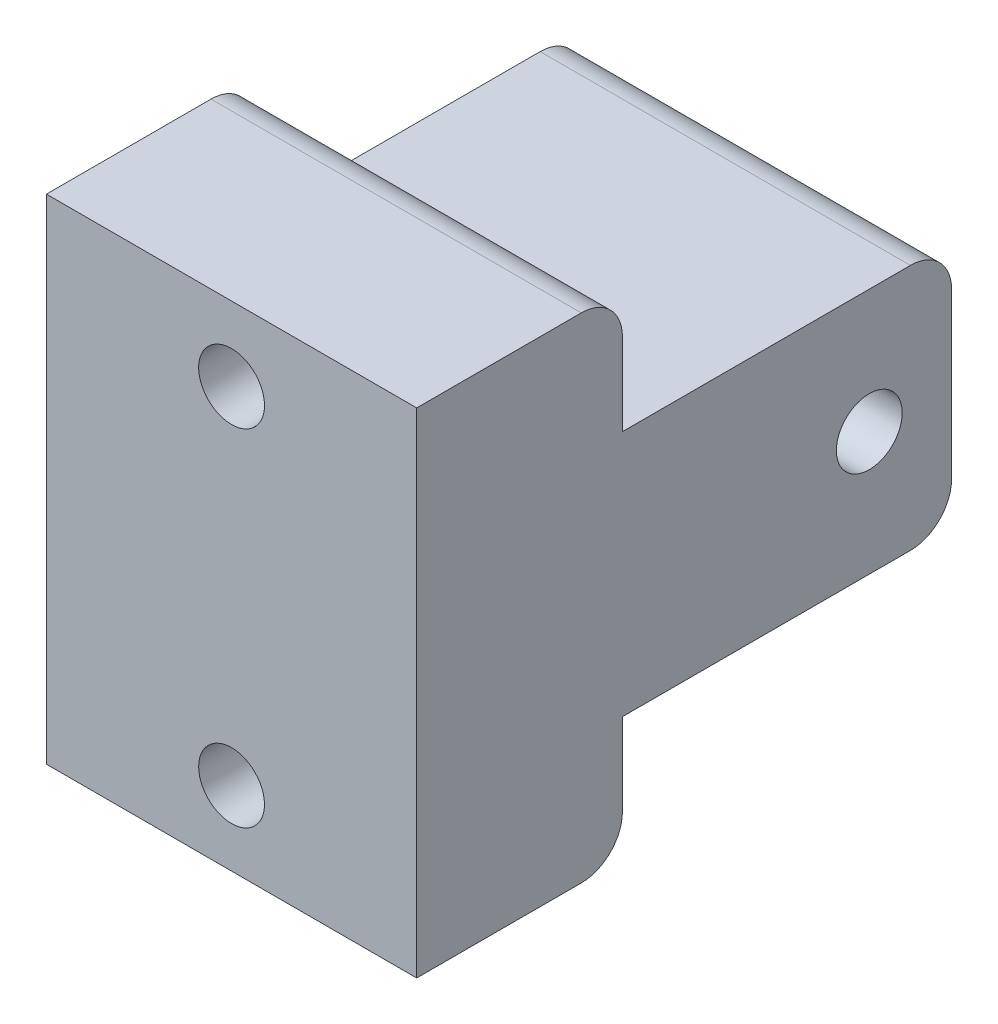
ISO-10303-21;
HEADER;
FILE_DESCRIPTION(('STEP AP214'),'2;1');
FILE_NAME('part.step','',(''),(''),'','','');
FILE_SCHEMA(('AUTOMOTIVE_DESIGN { 1 0 10303 214 1 1 1 1 }'));
ENDSEC;
DATA;
#1=APPLICATION_CONTEXT('core data for automotive mechanical design processes');
#2=APPLICATION_PROTOCOL_DEFINITION('international standard','automotive_design',2000,#1);
#3=PRODUCT_CONTEXT('',#1,'mechanical');
#4=PRODUCT('Part','Part','',(#3));
#5=PRODUCT_RELATED_PRODUCT_CATEGORY('part','',(#4));
#6=PRODUCT_DEFINITION_FORMATION('','',#4);
#7=PRODUCT_DEFINITION_CONTEXT('part definition',#1,'design');
#8=PRODUCT_DEFINITION('design','',#6,#7);
#9=PRODUCT_DEFINITION_SHAPE('','',#8);
#10=(LENGTH_UNIT() NAMED_UNIT(*) SI_UNIT(.MILLI.,.METRE.));
#11=(NAMED_UNIT(*) PLANE_ANGLE_UNIT() SI_UNIT($,.RADIAN.));
#12=(NAMED_UNIT(*) SI_UNIT($,.STERADIAN.) SOLID_ANGLE_UNIT());
#13=UNCERTAINTY_MEASURE_WITH_UNIT(LENGTH_MEASURE(1.E-05),#10,'distance_accuracy_value','');
#14=(GEOMETRIC_REPRESENTATION_CONTEXT(3) GLOBAL_UNCERTAINTY_ASSIGNED_CONTEXT((#13)) GLOBAL_UNIT_ASSIGNED_CONTEXT((#10,
#11,#12)) REPRESENTATION_CONTEXT('',''));
#15=CARTESIAN_POINT('',(0.,0.,0.));
#16=DIRECTION('',(0.,0.,1.));
#17=DIRECTION('',(1.,0.,0.));
#18=AXIS2_PLACEMENT_3D('',#15,#16,#17);
#19=CARTESIAN_POINT('',(45.,25.,25.));
#20=DIRECTION('',(1.,0.,0.));
#21=DIRECTION('',(0.,0.,-1.));
#22=AXIS2_PLACEMENT_3D('',#19,#20,#21);
#23=PLANE('',#22);
#24=DIRECTION('',(0.,1.,0.));
#25=VECTOR('',#24,1.);
#26=CARTESIAN_POINT('',(45.,15.,20.));
#27=LINE('',#26,#25);
#28=CARTESIAN_POINT('',(45.,15.,20.));
#29=VERTEX_POINT('',#28);
#30=CARTESIAN_POINT('',(45.,25.,20.));
#31=VERTEX_POINT('',#30);
#32=EDGE_CURVE('E140',#29,#31,#27,.T.);
#33=ORIENTED_EDGE('',*,*,#32,.T.);
#34=CARTESIAN_POINT('',(45.,25.,25.));
#35=DIRECTION('',(1.,0.,0.));
#36=DIRECTION('',(0.,0.,-1.));
#37=AXIS2_PLACEMENT_3D('',#34,#35,#36);
#38=CIRCLE('',#37,5.);
#39=CARTESIAN_POINT('',(45.,30.,25.));
#40=VERTEX_POINT('',#39);
#41=EDGE_CURVE('E131',#31,#40,#38,.T.);
#42=ORIENTED_EDGE('',*,*,#41,.T.);
#43=DIRECTION('',(0.,0.,1.));
#44=VECTOR('',#43,1.);
#45=CARTESIAN_POINT('',(45.,30.,25.));
#46=LINE('',#45,#44);
#47=CARTESIAN_POINT('',(45.,30.,45.));
#48=VERTEX_POINT('',#47);
#49=EDGE_CURVE('E139',#40,#48,#46,.T.);
#50=ORIENTED_EDGE('',*,*,#49,.T.);
#51=DIRECTION('',(0.,-1.,0.));
#52=VECTOR('',#51,1.);
#53=CARTESIAN_POINT('',(45.,-30.,45.));
#54=LINE('',#53,#52);
#55=CARTESIAN_POINT('',(45.,-30.,45.));
#56=VERTEX_POINT('',#55);
#57=EDGE_CURVE('E167',#48,#56,#54,.T.);
#58=ORIENTED_EDGE('',*,*,#57,.T.);
#59=DIRECTION('',(0.,0.,-1.));
#60=VECTOR('',#59,1.);
#61=CARTESIAN_POINT('',(45.,-30.,25.));
#62=LINE('',#61,#60);
#63=CARTESIAN_POINT('',(45.,-30.,25.));
#64=VERTEX_POINT('',#63);
#65=EDGE_CURVE('E169',#56,#64,#62,.T.);
#66=ORIENTED_EDGE('',*,*,#65,.T.);
#67=CARTESIAN_POINT('',(45.,-25.,25.));
#68=DIRECTION('',(1.,0.,0.));
#69=DIRECTION('',(0.,0.,-1.));
#70=AXIS2_PLACEMENT_3D('',#67,#68,#69);
#71=CIRCLE('',#70,5.);
#72=CARTESIAN_POINT('',(45.,-25.,20.));
#73=VERTEX_POINT('',#72);
#74=EDGE_CURVE('E171',#64,#73,#71,.T.);
#75=ORIENTED_EDGE('',*,*,#74,.T.);
#76=DIRECTION('',(0.,1.,0.));
#77=VECTOR('',#76,1.);
#78=CARTESIAN_POINT('',(45.,-25.,20.));
#79=LINE('',#78,#77);
#80=CARTESIAN_POINT('',(45.,-15.,20.));
#81=VERTEX_POINT('',#80);
#82=EDGE_CURVE('E173',#73,#81,#79,.T.);
#83=ORIENTED_EDGE('',*,*,#82,.T.);
#84=DIRECTION('',(0.,0.,-1.));
#85=VECTOR('',#84,1.);
#86=CARTESIAN_POINT('',(45.,-15.,20.));
#87=LINE('',#86,#85);
#88=CARTESIAN_POINT('',(45.,-15.,-15.));
#89=VERTEX_POINT('',#88);
#90=EDGE_CURVE('E175',#81,#89,#87,.T.);
#91=ORIENTED_EDGE('',*,*,#90,.T.);
#92=CARTESIAN_POINT('',(45.,-10.,-15.));
#93=DIRECTION('',(1.,0.,0.));
#94=DIRECTION('',(0.,0.,-1.));
#95=AXIS2_PLACEMENT_3D('',#92,#93,#94);
#96=CIRCLE('',#95,5.);
#97=CARTESIAN_POINT('',(45.,-9.99999999999996,-20.));
#98=VERTEX_POINT('',#97);
#99=EDGE_CURVE('E177',#89,#98,#96,.T.);
#100=ORIENTED_EDGE('',*,*,#99,.T.);
#101=DIRECTION('',(0.,1.,0.));
#102=VECTOR('',#101,1.);
#103=CARTESIAN_POINT('',(45.,9.99999999999997,-20.));
#104=LINE('',#103,#102);
#105=CARTESIAN_POINT('',(45.,9.99999999999997,-20.));
#106=VERTEX_POINT('',#105);
#107=EDGE_CURVE('E179',#98,#106,#104,.T.);
#108=ORIENTED_EDGE('',*,*,#107,.T.);
#109=CARTESIAN_POINT('',(45.,10.,-15.));
#110=DIRECTION('',(1.,0.,0.));
#111=DIRECTION('',(0.,0.,1.));
#112=AXIS2_PLACEMENT_3D('',#109,#110,#111);
#113=CIRCLE('',#112,5.);
#114=CARTESIAN_POINT('',(45.,15.,-15.));
#115=VERTEX_POINT('',#114);
#116=EDGE_CURVE('E181',#106,#115,#113,.T.);
#117=ORIENTED_EDGE('',*,*,#116,.T.);
#118=DIRECTION('',(0.,0.,1.));
#119=VECTOR('',#118,1.);
#120=CARTESIAN_POINT('',(45.,15.,20.));
#121=LINE('',#120,#119);
#122=EDGE_CURVE('E145',#115,#29,#121,.T.);
#123=ORIENTED_EDGE('',*,*,#122,.T.);
#124=EDGE_LOOP('',(#33,#42,#50,#58,#66,#75,#83,#91,#100,#108,#117,#123));
#125=FACE_BOUND('',#124,.T.);
#126=CARTESIAN_POINT('',(45.,0.,-9.99999999999999));
#127=DIRECTION('',(1.,0.,0.));
#128=DIRECTION('',(0.,0.,-1.));
#129=AXIS2_PLACEMENT_3D('',#126,#127,#128);
#130=CIRCLE('',#129,4.);
#131=CARTESIAN_POINT('',(45.,0.,-5.99999999999999));
#132=VERTEX_POINT('',#131);
#133=EDGE_CURVE('E156',#132,#132,#130,.T.);
#134=ORIENTED_EDGE('',*,*,#133,.F.);
#135=EDGE_LOOP('',(#134));
#136=FACE_BOUND('',#135,.T.);
#137=ADVANCED_FACE('F39',(#125,#136),#23,.T.);
#138=CARTESIAN_POINT('',(0.,25.,25.));
#139=DIRECTION('',(1.,0.,0.));
#140=DIRECTION('',(0.,0.,-1.));
#141=AXIS2_PLACEMENT_3D('',#138,#139,#140);
#142=PLANE('',#141);
#143=DIRECTION('',(0.,1.,0.));
#144=VECTOR('',#143,1.);
#145=CARTESIAN_POINT('',(0.,15.,20.));
#146=LINE('',#145,#144);
#147=CARTESIAN_POINT('',(0.,15.,20.));
#148=VERTEX_POINT('',#147);
#149=CARTESIAN_POINT('',(0.,25.,20.));
#150=VERTEX_POINT('',#149);
#151=EDGE_CURVE('E164',#148,#150,#146,.T.);
#152=ORIENTED_EDGE('',*,*,#151,.F.);
#153=DIRECTION('',(0.,0.,1.));
#154=VECTOR('',#153,1.);
#155=CARTESIAN_POINT('',(0.,15.,20.));
#156=LINE('',#155,#154);
#157=CARTESIAN_POINT('',(0.,15.,-15.));
#158=VERTEX_POINT('',#157);
#159=EDGE_CURVE('E149',#158,#148,#156,.T.);
#160=ORIENTED_EDGE('',*,*,#159,.F.);
#161=CARTESIAN_POINT('',(0.,10.,-15.));
#162=DIRECTION('',(1.,0.,0.));
#163=DIRECTION('',(0.,0.,1.));
#164=AXIS2_PLACEMENT_3D('',#161,#162,#163);
#165=CIRCLE('',#164,5.);
#166=CARTESIAN_POINT('',(0.,9.99999999999997,-20.));
#167=VERTEX_POINT('',#166);
#168=EDGE_CURVE('E205',#167,#158,#165,.T.);
#169=ORIENTED_EDGE('',*,*,#168,.F.);
#170=DIRECTION('',(0.,1.,0.));
#171=VECTOR('',#170,1.);
#172=CARTESIAN_POINT('',(0.,9.99999999999997,-20.));
#173=LINE('',#172,#171);
#174=CARTESIAN_POINT('',(0.,-9.99999999999996,-20.));
#175=VERTEX_POINT('',#174);
#176=EDGE_CURVE('E203',#175,#167,#173,.T.);
#177=ORIENTED_EDGE('',*,*,#176,.F.);
#178=CARTESIAN_POINT('',(0.,-10.,-15.));
#179=DIRECTION('',(1.,0.,0.));
#180=DIRECTION('',(0.,0.,-1.));
#181=AXIS2_PLACEMENT_3D('',#178,#179,#180);
#182=CIRCLE('',#181,5.);
#183=CARTESIAN_POINT('',(0.,-15.,-15.));
#184=VERTEX_POINT('',#183);
#185=EDGE_CURVE('E201',#184,#175,#182,.T.);
#186=ORIENTED_EDGE('',*,*,#185,.F.);
#187=DIRECTION('',(0.,0.,-1.));
#188=VECTOR('',#187,1.);
#189=CARTESIAN_POINT('',(0.,-15.,20.));
#190=LINE('',#189,#188);
#191=CARTESIAN_POINT('',(0.,-15.,20.));
#192=VERTEX_POINT('',#191);
#193=EDGE_CURVE('E199',#192,#184,#190,.T.);
#194=ORIENTED_EDGE('',*,*,#193,.F.);
#195=DIRECTION('',(0.,1.,0.));
#196=VECTOR('',#195,1.);
#197=CARTESIAN_POINT('',(0.,-25.,20.));
#198=LINE('',#197,#196);
#199=CARTESIAN_POINT('',(0.,-25.,20.));
#200=VERTEX_POINT('',#199);
#201=EDGE_CURVE('E197',#200,#192,#198,.T.);
#202=ORIENTED_EDGE('',*,*,#201,.F.);
#203=CARTESIAN_POINT('',(0.,-25.,25.));
#204=DIRECTION('',(1.,0.,0.));
#205=DIRECTION('',(0.,0.,-1.));
#206=AXIS2_PLACEMENT_3D('',#203,#204,#205);
#207=CIRCLE('',#206,5.);
#208=CARTESIAN_POINT('',(0.,-30.,25.));
#209=VERTEX_POINT('',#208);
#210=EDGE_CURVE('E194',#209,#200,#207,.T.);
#211=ORIENTED_EDGE('',*,*,#210,.F.);
#212=DIRECTION('',(0.,0.,-1.));
#213=VECTOR('',#212,1.);
#214=CARTESIAN_POINT('',(0.,-30.,25.));
#215=LINE('',#214,#213);
#216=CARTESIAN_POINT('',(0.,-30.,45.));
#217=VERTEX_POINT('',#216);
#218=EDGE_CURVE('E192',#217,#209,#215,.T.);
#219=ORIENTED_EDGE('',*,*,#218,.F.);
#220=DIRECTION('',(0.,-1.,0.));
#221=VECTOR('',#220,1.);
#222=CARTESIAN_POINT('',(0.,-30.,45.));
#223=LINE('',#222,#221);
#224=CARTESIAN_POINT('',(0.,30.,45.));
#225=VERTEX_POINT('',#224);
#226=EDGE_CURVE('E190',#225,#217,#223,.T.);
#227=ORIENTED_EDGE('',*,*,#226,.F.);
#228=DIRECTION('',(0.,0.,1.));
#229=VECTOR('',#228,1.);
#230=CARTESIAN_POINT('',(0.,30.,25.));
#231=LINE('',#230,#229);
#232=CARTESIAN_POINT('',(0.,30.,25.));
#233=VERTEX_POINT('',#232);
#234=EDGE_CURVE('E188',#233,#225,#231,.T.);
#235=ORIENTED_EDGE('',*,*,#234,.F.);
#236=CARTESIAN_POINT('',(0.,25.,25.));
#237=DIRECTION('',(1.,0.,0.));
#238=DIRECTION('',(0.,0.,-1.));
#239=AXIS2_PLACEMENT_3D('',#236,#237,#238);
#240=CIRCLE('',#239,5.);
#241=EDGE_CURVE('E186',#150,#233,#240,.T.);
#242=ORIENTED_EDGE('',*,*,#241,.F.);
#243=EDGE_LOOP('',(#152,#160,#169,#177,#186,#194,#202,#211,#219,#227,#235,#242));
#244=FACE_BOUND('',#243,.T.);
#245=CARTESIAN_POINT('',(0.,0.,-9.99999999999999));
#246=DIRECTION('',(1.,0.,0.));
#247=DIRECTION('',(0.,0.,-1.));
#248=AXIS2_PLACEMENT_3D('',#245,#246,#247);
#249=CIRCLE('',#248,4.);
#250=CARTESIAN_POINT('',(0.,0.,-5.99999999999999));
#251=VERTEX_POINT('',#250);
#252=EDGE_CURVE('E153',#251,#251,#249,.T.);
#253=ORIENTED_EDGE('',*,*,#252,.T.);
#254=EDGE_LOOP('',(#253));
#255=FACE_BOUND('',#254,.T.);
#256=ADVANCED_FACE('F242',(#244,#255),#142,.F.);
#257=CARTESIAN_POINT('',(45.,15.,20.));
#258=DIRECTION('',(0.,0.,1.));
#259=DIRECTION('',(1.,0.,0.));
#260=AXIS2_PLACEMENT_3D('',#257,#258,#259);
#261=PLANE('',#260);
#262=DIRECTION('',(-1.,0.,0.));
#263=VECTOR('',#262,1.);
#264=CARTESIAN_POINT('',(45.,25.,20.));
#265=LINE('',#264,#263);
#266=CARTESIAN_POINT('',(22.5,25.,20.));
#267=VERTEX_POINT('',#266);
#268=EDGE_CURVE('E48',#267,#150,#265,.T.);
#269=ORIENTED_EDGE('',*,*,#268,.F.);
#270=CARTESIAN_POINT('',(22.5,21.,20.));
#271=DIRECTION('',(0.,0.,1.));
#272=DIRECTION('',(1.,0.,0.));
#273=AXIS2_PLACEMENT_3D('',#270,#271,#272);
#274=CIRCLE('',#273,4.);
#275=EDGE_CURVE('E53',#267,#267,#274,.T.);
#276=ORIENTED_EDGE('',*,*,#275,.T.);
#277=EDGE_CURVE('E11',#31,#267,#265,.T.);
#278=ORIENTED_EDGE('',*,*,#277,.F.);
#279=ORIENTED_EDGE('',*,*,#32,.F.);
#280=DIRECTION('',(-1.,0.,0.));
#281=VECTOR('',#280,1.);
#282=CARTESIAN_POINT('',(45.,15.,20.));
#283=LINE('',#282,#281);
#284=EDGE_CURVE('E184',#29,#148,#283,.T.);
#285=ORIENTED_EDGE('',*,*,#284,.T.);
#286=ORIENTED_EDGE('',*,*,#151,.T.);
#287=EDGE_LOOP('',(#269,#276,#278,#279,#285,#286));
#288=FACE_BOUND('',#287,.T.);
#289=ADVANCED_FACE('F41',(#288),#261,.F.);
#290=CARTESIAN_POINT('',(45.,25.,25.));
#291=DIRECTION('',(-1.,0.,0.));
#292=DIRECTION('',(0.,0.,1.));
#293=AXIS2_PLACEMENT_3D('',#290,#291,#292);
#294=CYLINDRICAL_SURFACE('',#293,5.);
#295=ORIENTED_EDGE('',*,*,#241,.T.);
#296=DIRECTION('',(-1.,0.,0.));
#297=VECTOR('',#296,1.);
#298=CARTESIAN_POINT('',(45.,30.,25.));
#299=LINE('',#298,#297);
#300=EDGE_CURVE('E136',#40,#233,#299,.T.);
#301=ORIENTED_EDGE('',*,*,#300,.F.);
#302=ORIENTED_EDGE('',*,*,#41,.F.);
#303=ORIENTED_EDGE('',*,*,#277,.T.);
#304=ORIENTED_EDGE('',*,*,#268,.T.);
#305=EDGE_LOOP('',(#295,#301,#302,#303,#304));
#306=FACE_BOUND('',#305,.T.);
#307=ADVANCED_FACE('F133',(#306),#294,.T.);
#308=CARTESIAN_POINT('',(45.,30.,25.));
#309=DIRECTION('',(0.,-1.,0.));
#310=DIRECTION('',(0.,0.,-1.));
#311=AXIS2_PLACEMENT_3D('',#308,#309,#310);
#312=PLANE('',#311);
#313=ORIENTED_EDGE('',*,*,#234,.T.);
#314=DIRECTION('',(-1.,0.,0.));
#315=VECTOR('',#314,1.);
#316=CARTESIAN_POINT('',(45.,30.,45.));
#317=LINE('',#316,#315);
#318=EDGE_CURVE('E234',#48,#225,#317,.T.);
#319=ORIENTED_EDGE('',*,*,#318,.F.);
#320=ORIENTED_EDGE('',*,*,#49,.F.);
#321=ORIENTED_EDGE('',*,*,#300,.T.);
#322=EDGE_LOOP('',(#313,#319,#320,#321));
#323=FACE_BOUND('',#322,.T.);
#324=ADVANCED_FACE('F289',(#323),#312,.F.);
#325=CARTESIAN_POINT('',(45.,-30.,45.));
#326=DIRECTION('',(0.,0.,-1.));
#327=DIRECTION('',(-1.,0.,0.));
#328=AXIS2_PLACEMENT_3D('',#325,#326,#327);
#329=PLANE('',#328);
#330=CARTESIAN_POINT('',(22.5,21.,45.));
#331=DIRECTION('',(0.,0.,1.));
#332=DIRECTION('',(1.,0.,0.));
#333=AXIS2_PLACEMENT_3D('',#330,#331,#332);
#334=CIRCLE('',#333,4.);
#335=CARTESIAN_POINT('',(26.5,21.,45.));
#336=VERTEX_POINT('',#335);
#337=EDGE_CURVE('E158',#336,#336,#334,.T.);
#338=ORIENTED_EDGE('',*,*,#337,.F.);
#339=EDGE_LOOP('',(#338));
#340=FACE_BOUND('',#339,.T.);
#341=CARTESIAN_POINT('',(22.5,-21.,45.));
#342=DIRECTION('',(0.,0.,1.));
#343=DIRECTION('',(-1.,0.,0.));
#344=AXIS2_PLACEMENT_3D('',#341,#342,#343);
#345=CIRCLE('',#344,4.);
#346=CARTESIAN_POINT('',(18.5,-21.,45.));
#347=VERTEX_POINT('',#346);
#348=EDGE_CURVE('E161',#347,#347,#345,.T.);
#349=ORIENTED_EDGE('',*,*,#348,.F.);
#350=EDGE_LOOP('',(#349));
#351=FACE_BOUND('',#350,.T.);
#352=ORIENTED_EDGE('',*,*,#226,.T.);
#353=DIRECTION('',(-1.,0.,0.));
#354=VECTOR('',#353,1.);
#355=CARTESIAN_POINT('',(45.,-30.,45.));
#356=LINE('',#355,#354);
#357=EDGE_CURVE('E231',#56,#217,#356,.T.);
#358=ORIENTED_EDGE('',*,*,#357,.F.);
#359=ORIENTED_EDGE('',*,*,#57,.F.);
#360=ORIENTED_EDGE('',*,*,#318,.T.);
#361=EDGE_LOOP('',(#352,#358,#359,#360));
#362=FACE_BOUND('',#361,.T.);
#363=ADVANCED_FACE('F287',(#340,#351,#362),#329,.F.);
#364=CARTESIAN_POINT('',(45.,-30.,25.));
#365=DIRECTION('',(0.,1.,0.));
#366=DIRECTION('',(0.,0.,1.));
#367=AXIS2_PLACEMENT_3D('',#364,#365,#366);
#368=PLANE('',#367);
#369=ORIENTED_EDGE('',*,*,#218,.T.);
#370=DIRECTION('',(-1.,0.,0.));
#371=VECTOR('',#370,1.);
#372=CARTESIAN_POINT('',(45.,-30.,25.));
#373=LINE('',#372,#371);
#374=EDGE_CURVE('E228',#64,#209,#373,.T.);
#375=ORIENTED_EDGE('',*,*,#374,.F.);
#376=ORIENTED_EDGE('',*,*,#65,.F.);
#377=ORIENTED_EDGE('',*,*,#357,.T.);
#378=EDGE_LOOP('',(#369,#375,#376,#377));
#379=FACE_BOUND('',#378,.T.);
#380=ADVANCED_FACE('F282',(#379),#368,.F.);
#381=CARTESIAN_POINT('',(45.,-25.,25.));
#382=DIRECTION('',(-1.,0.,0.));
#383=DIRECTION('',(0.,0.,1.));
#384=AXIS2_PLACEMENT_3D('',#381,#382,#383);
#385=CYLINDRICAL_SURFACE('',#384,5.);
#386=ORIENTED_EDGE('',*,*,#210,.T.);
#387=DIRECTION('',(-1.,0.,0.));
#388=VECTOR('',#387,1.);
#389=CARTESIAN_POINT('',(45.,-25.,20.));
#390=LINE('',#389,#388);
#391=CARTESIAN_POINT('',(22.5,-25.,20.));
#392=VERTEX_POINT('',#391);
#393=EDGE_CURVE('E224',#392,#200,#390,.T.);
#394=ORIENTED_EDGE('',*,*,#393,.F.);
#395=EDGE_CURVE('E225',#73,#392,#390,.T.);
#396=ORIENTED_EDGE('',*,*,#395,.F.);
#397=ORIENTED_EDGE('',*,*,#74,.F.);
#398=ORIENTED_EDGE('',*,*,#374,.T.);
#399=EDGE_LOOP('',(#386,#394,#396,#397,#398));
#400=FACE_BOUND('',#399,.T.);
#401=ADVANCED_FACE('F277',(#400),#385,.T.);
#402=CARTESIAN_POINT('',(45.,-25.,20.));
#403=DIRECTION('',(0.,0.,1.));
#404=DIRECTION('',(1.,0.,0.));
#405=AXIS2_PLACEMENT_3D('',#402,#403,#404);
#406=PLANE('',#405);
#407=ORIENTED_EDGE('',*,*,#395,.T.);
#408=CARTESIAN_POINT('',(22.5,-21.,20.));
#409=DIRECTION('',(0.,0.,1.));
#410=DIRECTION('',(1.,0.,0.));
#411=AXIS2_PLACEMENT_3D('',#408,#409,#410);
#412=CIRCLE('',#411,4.);
#413=EDGE_CURVE('E43',#392,#392,#412,.T.);
#414=ORIENTED_EDGE('',*,*,#413,.T.);
#415=ORIENTED_EDGE('',*,*,#393,.T.);
#416=ORIENTED_EDGE('',*,*,#201,.T.);
#417=DIRECTION('',(-1.,0.,0.));
#418=VECTOR('',#417,1.);
#419=CARTESIAN_POINT('',(45.,-15.,20.));
#420=LINE('',#419,#418);
#421=EDGE_CURVE('E221',#81,#192,#420,.T.);
#422=ORIENTED_EDGE('',*,*,#421,.F.);
#423=ORIENTED_EDGE('',*,*,#82,.F.);
#424=EDGE_LOOP('',(#407,#414,#415,#416,#422,#423));
#425=FACE_BOUND('',#424,.T.);
#426=ADVANCED_FACE('F273',(#425),#406,.F.);
#427=CARTESIAN_POINT('',(45.,-15.,20.));
#428=DIRECTION('',(0.,1.,0.));
#429=DIRECTION('',(0.,0.,1.));
#430=AXIS2_PLACEMENT_3D('',#427,#428,#429);
#431=PLANE('',#430);
#432=ORIENTED_EDGE('',*,*,#193,.T.);
#433=DIRECTION('',(-1.,0.,0.));
#434=VECTOR('',#433,1.);
#435=CARTESIAN_POINT('',(45.,-15.,-15.));
#436=LINE('',#435,#434);
#437=EDGE_CURVE('E218',#89,#184,#436,.T.);
#438=ORIENTED_EDGE('',*,*,#437,.F.);
#439=ORIENTED_EDGE('',*,*,#90,.F.);
#440=ORIENTED_EDGE('',*,*,#421,.T.);
#441=EDGE_LOOP('',(#432,#438,#439,#440));
#442=FACE_BOUND('',#441,.T.);
#443=ADVANCED_FACE('F268',(#442),#431,.F.);
#444=CARTESIAN_POINT('',(45.,-10.,-15.));
#445=DIRECTION('',(-1.,0.,0.));
#446=DIRECTION('',(0.,0.,1.));
#447=AXIS2_PLACEMENT_3D('',#444,#445,#446);
#448=CYLINDRICAL_SURFACE('',#447,5.);
#449=ORIENTED_EDGE('',*,*,#185,.T.);
#450=DIRECTION('',(-1.,0.,0.));
#451=VECTOR('',#450,1.);
#452=CARTESIAN_POINT('',(45.,-9.99999999999996,-20.));
#453=LINE('',#452,#451);
#454=EDGE_CURVE('E215',#98,#175,#453,.T.);
#455=ORIENTED_EDGE('',*,*,#454,.F.);
#456=ORIENTED_EDGE('',*,*,#99,.F.);
#457=ORIENTED_EDGE('',*,*,#437,.T.);
#458=EDGE_LOOP('',(#449,#455,#456,#457));
#459=FACE_BOUND('',#458,.T.);
#460=ADVANCED_FACE('F262',(#459),#448,.T.);
#461=CARTESIAN_POINT('',(45.,9.99999999999997,-20.));
#462=DIRECTION('',(0.,0.,1.));
#463=DIRECTION('',(1.,0.,0.));
#464=AXIS2_PLACEMENT_3D('',#461,#462,#463);
#465=PLANE('',#464);
#466=ORIENTED_EDGE('',*,*,#176,.T.);
#467=DIRECTION('',(-1.,0.,0.));
#468=VECTOR('',#467,1.);
#469=CARTESIAN_POINT('',(45.,9.99999999999997,-20.));
#470=LINE('',#469,#468);
#471=EDGE_CURVE('E212',#106,#167,#470,.T.);
#472=ORIENTED_EDGE('',*,*,#471,.F.);
#473=ORIENTED_EDGE('',*,*,#107,.F.);
#474=ORIENTED_EDGE('',*,*,#454,.T.);
#475=EDGE_LOOP('',(#466,#472,#473,#474));
#476=FACE_BOUND('',#475,.T.);
#477=ADVANCED_FACE('F258',(#476),#465,.F.);
#478=CARTESIAN_POINT('',(45.,10.,-15.));
#479=DIRECTION('',(-1.,0.,0.));
#480=DIRECTION('',(0.,0.,1.));
#481=AXIS2_PLACEMENT_3D('',#478,#479,#480);
#482=CYLINDRICAL_SURFACE('',#481,5.);
#483=ORIENTED_EDGE('',*,*,#168,.T.);
#484=DIRECTION('',(-1.,0.,0.));
#485=VECTOR('',#484,1.);
#486=CARTESIAN_POINT('',(45.,15.,-15.));
#487=LINE('',#486,#485);
#488=EDGE_CURVE('E209',#115,#158,#487,.T.);
#489=ORIENTED_EDGE('',*,*,#488,.F.);
#490=ORIENTED_EDGE('',*,*,#116,.F.);
#491=ORIENTED_EDGE('',*,*,#471,.T.);
#492=EDGE_LOOP('',(#483,#489,#490,#491));
#493=FACE_BOUND('',#492,.T.);
#494=ADVANCED_FACE('F253',(#493),#482,.T.);
#495=CARTESIAN_POINT('',(45.,15.,20.));
#496=DIRECTION('',(0.,-1.,0.));
#497=DIRECTION('',(0.,0.,-1.));
#498=AXIS2_PLACEMENT_3D('',#495,#496,#497);
#499=PLANE('',#498);
#500=ORIENTED_EDGE('',*,*,#159,.T.);
#501=ORIENTED_EDGE('',*,*,#284,.F.);
#502=ORIENTED_EDGE('',*,*,#122,.F.);
#503=ORIENTED_EDGE('',*,*,#488,.T.);
#504=EDGE_LOOP('',(#500,#501,#502,#503));
#505=FACE_BOUND('',#504,.T.);
#506=ADVANCED_FACE('F247',(#505),#499,.F.);
#507=CARTESIAN_POINT('',(45.,0.,-9.99999999999999));
#508=DIRECTION('',(-1.,0.,0.));
#509=DIRECTION('',(0.,0.,1.));
#510=AXIS2_PLACEMENT_3D('',#507,#508,#509);
#511=CYLINDRICAL_SURFACE('',#510,4.);
#512=CARTESIAN_POINT('',(45.,0.,-5.99999999999999));
#513=CARTESIAN_POINT('',(44.53125,0.,-5.99999999999999));
#514=CARTESIAN_POINT('',(44.0625,0.,-5.99999999999999));
#515=CARTESIAN_POINT('',(43.125,0.,-5.99999999999999));
#516=CARTESIAN_POINT('',(42.65625,0.,-5.99999999999999));
#517=CARTESIAN_POINT('',(41.71875,0.,-5.99999999999999));
#518=CARTESIAN_POINT('',(41.25,0.,-5.99999999999999));
#519=CARTESIAN_POINT('',(40.3125,0.,-5.99999999999999));
#520=CARTESIAN_POINT('',(39.84375,0.,-5.99999999999999));
#521=CARTESIAN_POINT('',(38.90625,0.,-5.99999999999999));
#522=CARTESIAN_POINT('',(38.4375,0.,-5.99999999999999));
#523=CARTESIAN_POINT('',(37.5,0.,-5.99999999999999));
#524=CARTESIAN_POINT('',(37.03125,0.,-5.99999999999999));
#525=CARTESIAN_POINT('',(36.09375,0.,-5.99999999999999));
#526=CARTESIAN_POINT('',(35.625,0.,-5.99999999999999));
#527=CARTESIAN_POINT('',(34.6875,0.,-5.99999999999999));
#528=CARTESIAN_POINT('',(34.21875,0.,-5.99999999999999));
#529=CARTESIAN_POINT('',(33.28125,0.,-5.99999999999999));
#530=CARTESIAN_POINT('',(32.8125,0.,-5.99999999999999));
#531=CARTESIAN_POINT('',(31.875,0.,-5.99999999999999));
#532=CARTESIAN_POINT('',(31.40625,0.,-5.99999999999999));
#533=CARTESIAN_POINT('',(30.46875,0.,-5.99999999999999));
#534=CARTESIAN_POINT('',(30.,0.,-5.99999999999999));
#535=CARTESIAN_POINT('',(29.0625,0.,-5.99999999999999));
#536=CARTESIAN_POINT('',(28.59375,0.,-5.99999999999999));
#537=CARTESIAN_POINT('',(27.65625,0.,-5.99999999999999));
#538=CARTESIAN_POINT('',(27.1875,0.,-5.99999999999999));
#539=CARTESIAN_POINT('',(26.25,0.,-5.99999999999999));
#540=CARTESIAN_POINT('',(25.78125,0.,-5.99999999999999));
#541=CARTESIAN_POINT('',(24.84375,0.,-5.99999999999999));
#542=CARTESIAN_POINT('',(24.375,0.,-5.99999999999999));
#543=CARTESIAN_POINT('',(23.4375,0.,-5.99999999999999));
#544=CARTESIAN_POINT('',(22.96875,0.,-5.99999999999999));
#545=CARTESIAN_POINT('',(22.03125,0.,-5.99999999999999));
#546=CARTESIAN_POINT('',(21.5625,0.,-5.99999999999999));
#547=CARTESIAN_POINT('',(20.625,0.,-5.99999999999999));
#548=CARTESIAN_POINT('',(20.15625,0.,-5.99999999999999));
#549=CARTESIAN_POINT('',(19.21875,0.,-5.99999999999999));
#550=CARTESIAN_POINT('',(18.75,0.,-5.99999999999999));
#551=CARTESIAN_POINT('',(17.8125,0.,-5.99999999999999));
#552=CARTESIAN_POINT('',(17.34375,0.,-5.99999999999999));
#553=CARTESIAN_POINT('',(16.40625,0.,-5.99999999999999));
#554=CARTESIAN_POINT('',(15.9375,0.,-5.99999999999999));
#555=CARTESIAN_POINT('',(15.,0.,-5.99999999999999));
#556=CARTESIAN_POINT('',(14.53125,0.,-5.99999999999999));
#557=CARTESIAN_POINT('',(13.59375,0.,-5.99999999999999));
#558=CARTESIAN_POINT('',(13.125,0.,-5.99999999999999));
#559=CARTESIAN_POINT('',(12.1875,0.,-5.99999999999999));
#560=CARTESIAN_POINT('',(11.71875,0.,-5.99999999999999));
#561=CARTESIAN_POINT('',(10.78125,0.,-5.99999999999999));
#562=CARTESIAN_POINT('',(10.3125,0.,-5.99999999999999));
#563=CARTESIAN_POINT('',(9.37499999999999,0.,-5.99999999999999));
#564=CARTESIAN_POINT('',(8.90624999999999,0.,-5.99999999999999));
#565=CARTESIAN_POINT('',(7.96874999999999,0.,-5.99999999999999));
#566=CARTESIAN_POINT('',(7.5,0.,-5.99999999999999));
#567=CARTESIAN_POINT('',(6.56249999999999,0.,-5.99999999999999));
#568=CARTESIAN_POINT('',(6.09374999999999,0.,-5.99999999999999));
#569=CARTESIAN_POINT('',(5.15624999999999,0.,-5.99999999999999));
#570=CARTESIAN_POINT('',(4.68749999999999,0.,-5.99999999999999));
#571=CARTESIAN_POINT('',(3.74999999999999,0.,-5.99999999999999));
#572=CARTESIAN_POINT('',(3.28124999999999,0.,-5.99999999999999));
#573=CARTESIAN_POINT('',(2.34374999999999,0.,-5.99999999999999));
#574=CARTESIAN_POINT('',(1.87499999999999,0.,-5.99999999999999));
#575=CARTESIAN_POINT('',(0.937499999999992,0.,-5.99999999999999));
#576=CARTESIAN_POINT('',(0.468749999999993,0.,-5.99999999999999));
#577=CARTESIAN_POINT('',(0.,0.,-5.99999999999999));
#578=B_SPLINE_CURVE_WITH_KNOTS('',3,(#512,#513,#514,#515,#516,#517,#518,#519,#520,#521,#522,
#523,#524,#525,#526,#527,#528,#529,#530,#531,#532,#533,#534,#535,#536,#537,#538,#539,#540,#541,
#542,#543,#544,#545,#546,#547,#548,#549,#550,#551,#552,#553,#554,#555,#556,#557,#558,#559,#560,
#561,#562,#563,#564,#565,#566,#567,#568,#569,#570,#571,#572,#573,#574,#575,#576,#577),
.UNSPECIFIED.,.F.,.F.,(4,2,2,2,2,2,2,2,2,2,2,2,2,2,2,2,2,2,2,2,2,2,2,2,2,2,2,2,2,2,2,2,4),(0.,
1.40625,2.8125,4.21874999999999,5.625,7.03125,8.43749999999999,9.84375,11.25,12.65625,14.0625,
15.46875,16.875,18.28125,19.6875,21.09375,22.5,23.90625,25.3125,26.71875,28.125,29.53125,
30.9375,32.34375,33.75,35.15625,36.5625,37.96875,39.375,40.78125,42.1875,43.59375,45.),.UNSPECIFIED.);
#579=EDGE_CURVE('BSEAM305',#132,#251,#578,.T.);
#580=ORIENTED_EDGE('',*,*,#133,.T.);
#581=ORIENTED_EDGE('',*,*,#252,.F.);
#582=ORIENTED_EDGE('',*,*,#579,.T.);
#583=ORIENTED_EDGE('',*,*,#579,.F.);
#584=EDGE_LOOP('',(#580,#582,#581,#583));
#585=FACE_BOUND('',#584,.T.);
#586=ADVANCED_FACE('F305',(#585),#511,.F.);
#587=CARTESIAN_POINT('',(22.5,-21.,0.));
#588=DIRECTION('',(0.,0.,1.));
#589=DIRECTION('',(1.,0.,0.));
#590=AXIS2_PLACEMENT_3D('',#587,#588,#589);
#591=CYLINDRICAL_SURFACE('',#590,4.);
#592=ORIENTED_EDGE('',*,*,#348,.T.);
#593=EDGE_LOOP('',(#592));
#594=FACE_BOUND('',#593,.T.);
#595=ORIENTED_EDGE('',*,*,#413,.F.);
#596=EDGE_LOOP('',(#595));
#597=FACE_BOUND('',#596,.T.);
#598=ADVANCED_FACE('F362',(#594,#597),#591,.F.);
#599=CARTESIAN_POINT('',(22.5,21.,0.));
#600=DIRECTION('',(0.,0.,1.));
#601=DIRECTION('',(1.,0.,0.));
#602=AXIS2_PLACEMENT_3D('',#599,#600,#601);
#603=CYLINDRICAL_SURFACE('',#602,4.);
#604=ORIENTED_EDGE('',*,*,#337,.T.);
#605=EDGE_LOOP('',(#604));
#606=FACE_BOUND('',#605,.T.);
#607=ORIENTED_EDGE('',*,*,#275,.F.);
#608=EDGE_LOOP('',(#607));
#609=FACE_BOUND('',#608,.T.);
#610=ADVANCED_FACE('F369',(#606,#609),#603,.F.);
#611=CLOSED_SHELL('',(#137,#256,#289,#307,#324,#363,#380,#401,#426,#443,#460,#477,#494,#506,
#586,#598,#610));
#612=MANIFOLD_SOLID_BREP('B2',#611);
#613=ADVANCED_BREP_SHAPE_REPRESENTATION('',(#18,#612),#14);
#614=SHAPE_DEFINITION_REPRESENTATION(#9,#613);
ENDSEC;
END-ISO-10303-21;
